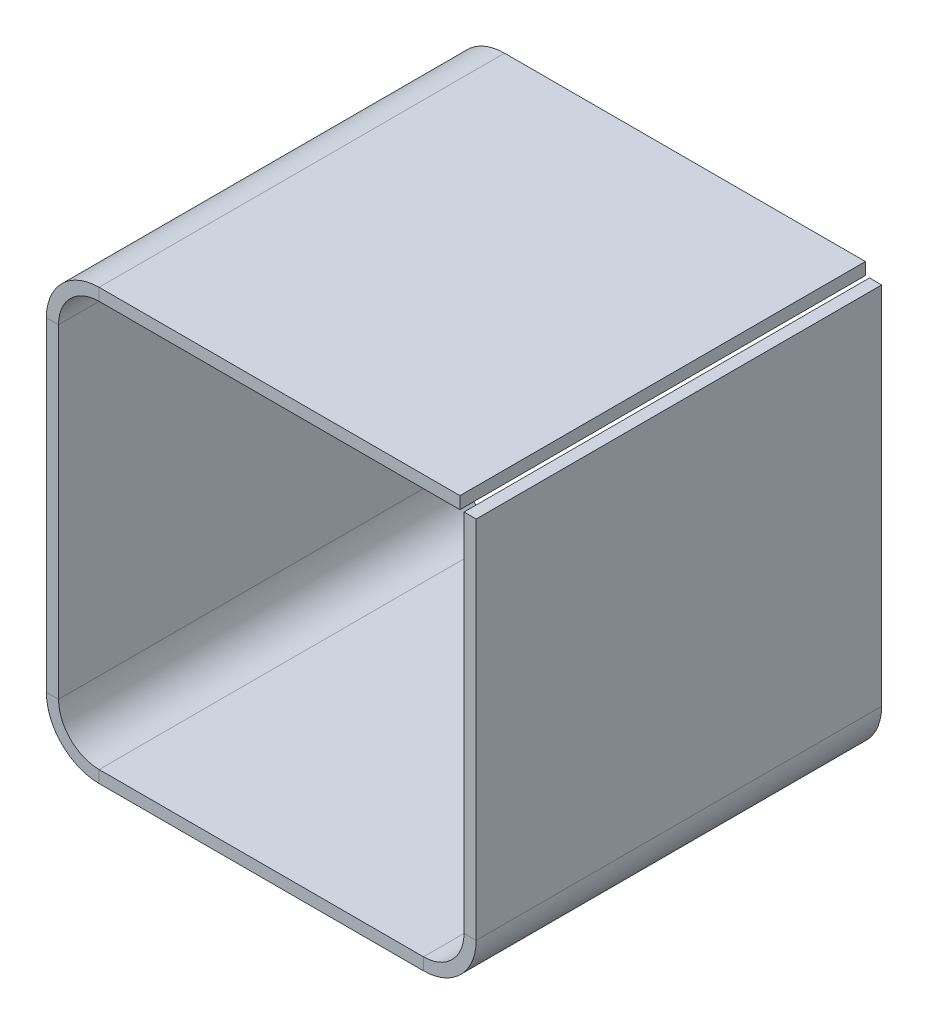
ISO-10303-21;
HEADER;
FILE_DESCRIPTION(('STEP AP214'),'2;1');
FILE_NAME('part.step','',(''),(''),'','','');
FILE_SCHEMA(('AUTOMOTIVE_DESIGN { 1 0 10303 214 1 1 1 1 }'));
ENDSEC;
DATA;
#1=APPLICATION_CONTEXT('core data for automotive mechanical design processes');
#2=APPLICATION_PROTOCOL_DEFINITION('international standard','automotive_design',2000,#1);
#3=PRODUCT_CONTEXT('',#1,'mechanical');
#4=PRODUCT('Part','Part','',(#3));
#5=PRODUCT_RELATED_PRODUCT_CATEGORY('part','',(#4));
#6=PRODUCT_DEFINITION_FORMATION('','',#4);
#7=PRODUCT_DEFINITION_CONTEXT('part definition',#1,'design');
#8=PRODUCT_DEFINITION('design','',#6,#7);
#9=PRODUCT_DEFINITION_SHAPE('','',#8);
#10=(LENGTH_UNIT() NAMED_UNIT(*) SI_UNIT(.MILLI.,.METRE.));
#11=(NAMED_UNIT(*) PLANE_ANGLE_UNIT() SI_UNIT($,.RADIAN.));
#12=(NAMED_UNIT(*) SI_UNIT($,.STERADIAN.) SOLID_ANGLE_UNIT());
#13=UNCERTAINTY_MEASURE_WITH_UNIT(LENGTH_MEASURE(1.E-05),#10,'distance_accuracy_value','');
#14=(GEOMETRIC_REPRESENTATION_CONTEXT(3) GLOBAL_UNCERTAINTY_ASSIGNED_CONTEXT((#13)) GLOBAL_UNIT_ASSIGNED_CONTEXT((#10,
#11,#12)) REPRESENTATION_CONTEXT('',''));
#15=CARTESIAN_POINT('',(0.,0.,0.));
#16=DIRECTION('',(0.,0.,1.));
#17=DIRECTION('',(1.,0.,0.));
#18=AXIS2_PLACEMENT_3D('',#15,#16,#17);
#19=CARTESIAN_POINT('',(55.3093945286018,10.,100.));
#20=DIRECTION('',(0.,0.,1.));
#21=DIRECTION('',(1.,0.,0.));
#22=AXIS2_PLACEMENT_3D('',#19,#20,#21);
#23=PLANE('',#22);
#24=DIRECTION('',(1.,0.,0.));
#25=VECTOR('',#24,1.);
#26=CARTESIAN_POINT('',(55.3093945286018,10.,100.));
#27=LINE('',#26,#25);
#28=CARTESIAN_POINT('',(55.3093945286018,10.,100.));
#29=VERTEX_POINT('',#28);
#30=CARTESIAN_POINT('',(58.3093945286018,10.,100.));
#31=VERTEX_POINT('',#30);
#32=EDGE_CURVE('E11',#29,#31,#27,.T.);
#33=ORIENTED_EDGE('',*,*,#32,.F.);
#34=CARTESIAN_POINT('',(45.3093945286018,10.,100.));
#35=DIRECTION('',(0.,0.,1.));
#36=DIRECTION('',(1.,0.,0.));
#37=AXIS2_PLACEMENT_3D('',#34,#35,#36);
#38=CIRCLE('',#37,10.);
#39=CARTESIAN_POINT('',(45.3093945286018,0.,100.));
#40=VERTEX_POINT('',#39);
#41=EDGE_CURVE('E299',#40,#29,#38,.T.);
#42=ORIENTED_EDGE('',*,*,#41,.F.);
#43=DIRECTION('',(0.,1.,0.));
#44=VECTOR('',#43,1.);
#45=CARTESIAN_POINT('',(45.3093945286018,-3.,100.));
#46=LINE('',#45,#44);
#47=CARTESIAN_POINT('',(45.3093945286018,-3.,100.));
#48=VERTEX_POINT('',#47);
#49=EDGE_CURVE('E46',#48,#40,#46,.T.);
#50=ORIENTED_EDGE('',*,*,#49,.F.);
#51=CARTESIAN_POINT('',(45.3093945286018,10.,100.));
#52=DIRECTION('',(0.,0.,1.));
#53=DIRECTION('',(1.,0.,0.));
#54=AXIS2_PLACEMENT_3D('',#51,#52,#53);
#55=CIRCLE('',#54,13.);
#56=EDGE_CURVE('E194',#48,#31,#55,.T.);
#57=ORIENTED_EDGE('',*,*,#56,.T.);
#58=EDGE_LOOP('',(#33,#42,#50,#57));
#59=FACE_BOUND('',#58,.T.);
#60=ADVANCED_FACE('F38',(#59),#23,.T.);
#61=CARTESIAN_POINT('',(45.3093945286018,-3.,100.));
#62=DIRECTION('',(0.,0.,1.));
#63=DIRECTION('',(1.,0.,0.));
#64=AXIS2_PLACEMENT_3D('',#61,#62,#63);
#65=PLANE('',#64);
#66=DIRECTION('',(0.,1.,0.));
#67=VECTOR('',#66,1.);
#68=CARTESIAN_POINT('',(55.3093945286019,0.,100.));
#69=LINE('',#68,#67);
#70=CARTESIAN_POINT('',(55.3093945286015,100.,100.));
#71=VERTEX_POINT('',#70);
#72=EDGE_CURVE('E303',#29,#71,#69,.T.);
#73=ORIENTED_EDGE('',*,*,#72,.F.);
#74=ORIENTED_EDGE('',*,*,#32,.T.);
#75=DIRECTION('',(0.,1.,0.));
#76=VECTOR('',#75,1.);
#77=CARTESIAN_POINT('',(58.3093945286019,0.,100.));
#78=LINE('',#77,#76);
#79=CARTESIAN_POINT('',(58.3093945286015,100.,100.));
#80=VERTEX_POINT('',#79);
#81=EDGE_CURVE('E118',#31,#80,#78,.T.);
#82=ORIENTED_EDGE('',*,*,#81,.T.);
#83=DIRECTION('',(1.,0.,0.));
#84=VECTOR('',#83,1.);
#85=CARTESIAN_POINT('',(55.3093945286015,100.,100.));
#86=LINE('',#85,#84);
#87=EDGE_CURVE('E694',#71,#80,#86,.T.);
#88=ORIENTED_EDGE('',*,*,#87,.F.);
#89=EDGE_LOOP('',(#73,#74,#82,#88));
#90=FACE_BOUND('',#89,.T.);
#91=ADVANCED_FACE('F392',(#90),#65,.T.);
#92=CARTESIAN_POINT('',(45.3093945286018,0.,0.));
#93=DIRECTION('',(0.,0.,-1.));
#94=DIRECTION('',(-1.,0.,0.));
#95=AXIS2_PLACEMENT_3D('',#92,#93,#94);
#96=PLANE('',#95);
#97=DIRECTION('',(0.,-1.,0.));
#98=VECTOR('',#97,1.);
#99=CARTESIAN_POINT('',(45.3093945286018,0.,0.));
#100=LINE('',#99,#98);
#101=CARTESIAN_POINT('',(45.3093945286018,0.,0.));
#102=VERTEX_POINT('',#101);
#103=CARTESIAN_POINT('',(45.3093945286018,-3.,0.));
#104=VERTEX_POINT('',#103);
#105=EDGE_CURVE('E105',#102,#104,#100,.T.);
#106=ORIENTED_EDGE('',*,*,#105,.F.);
#107=CARTESIAN_POINT('',(45.3093945286018,10.,0.));
#108=DIRECTION('',(0.,0.,1.));
#109=DIRECTION('',(1.,0.,0.));
#110=AXIS2_PLACEMENT_3D('',#107,#108,#109);
#111=CIRCLE('',#110,10.);
#112=CARTESIAN_POINT('',(55.3093945286018,10.,0.));
#113=VERTEX_POINT('',#112);
#114=EDGE_CURVE('E209',#102,#113,#111,.T.);
#115=ORIENTED_EDGE('',*,*,#114,.T.);
#116=DIRECTION('',(-1.,0.,0.));
#117=VECTOR('',#116,1.);
#118=CARTESIAN_POINT('',(58.3093945286018,10.,0.));
#119=LINE('',#118,#117);
#120=CARTESIAN_POINT('',(58.3093945286018,10.,0.));
#121=VERTEX_POINT('',#120);
#122=EDGE_CURVE('E112',#121,#113,#119,.T.);
#123=ORIENTED_EDGE('',*,*,#122,.F.);
#124=CARTESIAN_POINT('',(45.3093945286018,10.,0.));
#125=DIRECTION('',(0.,0.,1.));
#126=DIRECTION('',(1.,0.,0.));
#127=AXIS2_PLACEMENT_3D('',#124,#125,#126);
#128=CIRCLE('',#127,13.);
#129=EDGE_CURVE('E240',#104,#121,#128,.T.);
#130=ORIENTED_EDGE('',*,*,#129,.F.);
#131=EDGE_LOOP('',(#106,#115,#123,#130));
#132=FACE_BOUND('',#131,.T.);
#133=ADVANCED_FACE('F396',(#132),#96,.T.);
#134=CARTESIAN_POINT('',(58.3093945286018,10.,0.));
#135=DIRECTION('',(0.,0.,-1.));
#136=DIRECTION('',(-1.,0.,0.));
#137=AXIS2_PLACEMENT_3D('',#134,#135,#136);
#138=PLANE('',#137);
#139=DIRECTION('',(1.,0.,0.));
#140=VECTOR('',#139,1.);
#141=CARTESIAN_POINT('',(-44.6906054713981,0.,0.));
#142=LINE('',#141,#140);
#143=CARTESIAN_POINT('',(-34.6906054713981,0.,0.));
#144=VERTEX_POINT('',#143);
#145=EDGE_CURVE('E211',#144,#102,#142,.T.);
#146=ORIENTED_EDGE('',*,*,#145,.T.);
#147=ORIENTED_EDGE('',*,*,#105,.T.);
#148=DIRECTION('',(1.,0.,0.));
#149=VECTOR('',#148,1.);
#150=CARTESIAN_POINT('',(-44.6906054713981,-3.,0.));
#151=LINE('',#150,#149);
#152=CARTESIAN_POINT('',(-34.6906054713981,-3.,0.));
#153=VERTEX_POINT('',#152);
#154=EDGE_CURVE('E238',#153,#104,#151,.T.);
#155=ORIENTED_EDGE('',*,*,#154,.F.);
#156=DIRECTION('',(0.,1.,0.));
#157=VECTOR('',#156,1.);
#158=CARTESIAN_POINT('',(-34.6906054713981,-3.,0.));
#159=LINE('',#158,#157);
#160=EDGE_CURVE('E286',#153,#144,#159,.T.);
#161=ORIENTED_EDGE('',*,*,#160,.T.);
#162=EDGE_LOOP('',(#146,#147,#155,#161));
#163=FACE_BOUND('',#162,.T.);
#164=ADVANCED_FACE('F340',(#163),#138,.T.);
#165=CARTESIAN_POINT('',(-34.6906054713981,0.,100.));
#166=DIRECTION('',(0.,0.,1.));
#167=DIRECTION('',(1.,0.,0.));
#168=AXIS2_PLACEMENT_3D('',#165,#166,#167);
#169=PLANE('',#168);
#170=DIRECTION('',(0.,-1.,0.));
#171=VECTOR('',#170,1.);
#172=CARTESIAN_POINT('',(-34.6906054713981,0.,100.));
#173=LINE('',#172,#171);
#174=CARTESIAN_POINT('',(-34.6906054713981,0.,100.));
#175=VERTEX_POINT('',#174);
#176=CARTESIAN_POINT('',(-34.6906054713981,-3.,100.));
#177=VERTEX_POINT('',#176);
#178=EDGE_CURVE('E158',#175,#177,#173,.T.);
#179=ORIENTED_EDGE('',*,*,#178,.F.);
#180=CARTESIAN_POINT('',(-34.6906054713981,10.,100.));
#181=DIRECTION('',(0.,0.,1.));
#182=DIRECTION('',(1.,0.,0.));
#183=AXIS2_PLACEMENT_3D('',#180,#181,#182);
#184=CIRCLE('',#183,10.);
#185=CARTESIAN_POINT('',(-44.6906054713981,10.,100.));
#186=VERTEX_POINT('',#185);
#187=EDGE_CURVE('E306',#186,#175,#184,.T.);
#188=ORIENTED_EDGE('',*,*,#187,.F.);
#189=DIRECTION('',(1.,0.,0.));
#190=VECTOR('',#189,1.);
#191=CARTESIAN_POINT('',(-47.6906054713981,10.,100.));
#192=LINE('',#191,#190);
#193=CARTESIAN_POINT('',(-47.6906054713981,10.,100.));
#194=VERTEX_POINT('',#193);
#195=EDGE_CURVE('E170',#194,#186,#192,.T.);
#196=ORIENTED_EDGE('',*,*,#195,.F.);
#197=CARTESIAN_POINT('',(-34.6906054713981,10.,100.));
#198=DIRECTION('',(0.,0.,1.));
#199=DIRECTION('',(1.,0.,0.));
#200=AXIS2_PLACEMENT_3D('',#197,#198,#199);
#201=CIRCLE('',#200,13.);
#202=EDGE_CURVE('E173',#194,#177,#201,.T.);
#203=ORIENTED_EDGE('',*,*,#202,.T.);
#204=EDGE_LOOP('',(#179,#188,#196,#203));
#205=FACE_BOUND('',#204,.T.);
#206=ADVANCED_FACE('F175',(#205),#169,.T.);
#207=CARTESIAN_POINT('',(-47.6906054713981,10.,100.));
#208=DIRECTION('',(0.,0.,1.));
#209=DIRECTION('',(1.,0.,0.));
#210=AXIS2_PLACEMENT_3D('',#207,#208,#209);
#211=PLANE('',#210);
#212=DIRECTION('',(1.,0.,0.));
#213=VECTOR('',#212,1.);
#214=CARTESIAN_POINT('',(-44.6906054713981,0.,100.));
#215=LINE('',#214,#213);
#216=EDGE_CURVE('E165',#175,#40,#215,.T.);
#217=ORIENTED_EDGE('',*,*,#216,.F.);
#218=ORIENTED_EDGE('',*,*,#178,.T.);
#219=DIRECTION('',(1.,0.,0.));
#220=VECTOR('',#219,1.);
#221=CARTESIAN_POINT('',(-44.6906054713981,-3.,100.));
#222=LINE('',#221,#220);
#223=EDGE_CURVE('E162',#177,#48,#222,.T.);
#224=ORIENTED_EDGE('',*,*,#223,.T.);
#225=ORIENTED_EDGE('',*,*,#49,.T.);
#226=EDGE_LOOP('',(#217,#218,#224,#225));
#227=FACE_BOUND('',#226,.T.);
#228=ADVANCED_FACE('F160',(#227),#211,.T.);
#229=CARTESIAN_POINT('',(-44.6906054713981,10.,0.));
#230=DIRECTION('',(0.,0.,-1.));
#231=DIRECTION('',(-1.,0.,0.));
#232=AXIS2_PLACEMENT_3D('',#229,#230,#231);
#233=PLANE('',#232);
#234=DIRECTION('',(-1.,0.,0.));
#235=VECTOR('',#234,1.);
#236=CARTESIAN_POINT('',(-44.6906054713981,10.,0.));
#237=LINE('',#236,#235);
#238=CARTESIAN_POINT('',(-44.6906054713981,10.,0.));
#239=VERTEX_POINT('',#238);
#240=CARTESIAN_POINT('',(-47.6906054713981,10.,0.));
#241=VERTEX_POINT('',#240);
#242=EDGE_CURVE('E288',#239,#241,#237,.T.);
#243=ORIENTED_EDGE('',*,*,#242,.F.);
#244=CARTESIAN_POINT('',(-34.6906054713981,10.,0.));
#245=DIRECTION('',(0.,0.,1.));
#246=DIRECTION('',(1.,0.,0.));
#247=AXIS2_PLACEMENT_3D('',#244,#245,#246);
#248=CIRCLE('',#247,10.);
#249=EDGE_CURVE('E213',#239,#144,#248,.T.);
#250=ORIENTED_EDGE('',*,*,#249,.T.);
#251=ORIENTED_EDGE('',*,*,#160,.F.);
#252=CARTESIAN_POINT('',(-34.6906054713981,10.,0.));
#253=DIRECTION('',(0.,0.,1.));
#254=DIRECTION('',(1.,0.,0.));
#255=AXIS2_PLACEMENT_3D('',#252,#253,#254);
#256=CIRCLE('',#255,13.);
#257=EDGE_CURVE('E186',#241,#153,#256,.T.);
#258=ORIENTED_EDGE('',*,*,#257,.F.);
#259=EDGE_LOOP('',(#243,#250,#251,#258));
#260=FACE_BOUND('',#259,.T.);
#261=ADVANCED_FACE('F338',(#260),#233,.T.);
#262=CARTESIAN_POINT('',(-34.6906054713981,-3.,0.));
#263=DIRECTION('',(0.,0.,-1.));
#264=DIRECTION('',(-1.,0.,0.));
#265=AXIS2_PLACEMENT_3D('',#262,#263,#264);
#266=PLANE('',#265);
#267=DIRECTION('',(0.,-1.,0.));
#268=VECTOR('',#267,1.);
#269=CARTESIAN_POINT('',(-44.6906054713978,100.,0.));
#270=LINE('',#269,#268);
#271=CARTESIAN_POINT('',(-44.6906054713978,90.,0.));
#272=VERTEX_POINT('',#271);
#273=EDGE_CURVE('E216',#272,#239,#270,.T.);
#274=ORIENTED_EDGE('',*,*,#273,.T.);
#275=ORIENTED_EDGE('',*,*,#242,.T.);
#276=DIRECTION('',(0.,-1.,0.));
#277=VECTOR('',#276,1.);
#278=CARTESIAN_POINT('',(-47.6906054713978,100.,0.));
#279=LINE('',#278,#277);
#280=CARTESIAN_POINT('',(-47.6906054713978,90.,0.));
#281=VERTEX_POINT('',#280);
#282=EDGE_CURVE('E234',#281,#241,#279,.T.);
#283=ORIENTED_EDGE('',*,*,#282,.F.);
#284=DIRECTION('',(1.,0.,0.));
#285=VECTOR('',#284,1.);
#286=CARTESIAN_POINT('',(-47.6906054713978,90.,0.));
#287=LINE('',#286,#285);
#288=EDGE_CURVE('E278',#281,#272,#287,.T.);
#289=ORIENTED_EDGE('',*,*,#288,.T.);
#290=EDGE_LOOP('',(#274,#275,#283,#289));
#291=FACE_BOUND('',#290,.T.);
#292=ADVANCED_FACE('F375',(#291),#266,.T.);
#293=CARTESIAN_POINT('',(-44.6906054713978,90.,100.));
#294=DIRECTION('',(0.,0.,1.));
#295=DIRECTION('',(1.,0.,0.));
#296=AXIS2_PLACEMENT_3D('',#293,#294,#295);
#297=PLANE('',#296);
#298=DIRECTION('',(-1.,0.,0.));
#299=VECTOR('',#298,1.);
#300=CARTESIAN_POINT('',(-44.6906054713978,90.,100.));
#301=LINE('',#300,#299);
#302=CARTESIAN_POINT('',(-44.6906054713978,90.,100.));
#303=VERTEX_POINT('',#302);
#304=CARTESIAN_POINT('',(-47.6906054713978,90.,100.));
#305=VERTEX_POINT('',#304);
#306=EDGE_CURVE('E284',#303,#305,#301,.T.);
#307=ORIENTED_EDGE('',*,*,#306,.F.);
#308=CARTESIAN_POINT('',(-34.6906054713978,90.,100.));
#309=DIRECTION('',(0.,0.,1.));
#310=DIRECTION('',(1.,0.,0.));
#311=AXIS2_PLACEMENT_3D('',#308,#309,#310);
#312=CIRCLE('',#311,10.);
#313=CARTESIAN_POINT('',(-34.6906054713978,100.,100.));
#314=VERTEX_POINT('',#313);
#315=EDGE_CURVE('E314',#314,#303,#312,.T.);
#316=ORIENTED_EDGE('',*,*,#315,.F.);
#317=DIRECTION('',(0.,-1.,0.));
#318=VECTOR('',#317,1.);
#319=CARTESIAN_POINT('',(-34.6906054713978,103.,100.));
#320=LINE('',#319,#318);
#321=CARTESIAN_POINT('',(-34.6906054713978,103.,100.));
#322=VERTEX_POINT('',#321);
#323=EDGE_CURVE('E282',#322,#314,#320,.T.);
#324=ORIENTED_EDGE('',*,*,#323,.F.);
#325=CARTESIAN_POINT('',(-34.6906054713978,90.,100.));
#326=DIRECTION('',(0.,0.,1.));
#327=DIRECTION('',(1.,0.,0.));
#328=AXIS2_PLACEMENT_3D('',#325,#326,#327);
#329=CIRCLE('',#328,13.);
#330=EDGE_CURVE('E326',#322,#305,#329,.T.);
#331=ORIENTED_EDGE('',*,*,#330,.T.);
#332=EDGE_LOOP('',(#307,#316,#324,#331));
#333=FACE_BOUND('',#332,.T.);
#334=ADVANCED_FACE('F353',(#333),#297,.T.);
#335=CARTESIAN_POINT('',(-34.6906054713978,103.,100.));
#336=DIRECTION('',(0.,0.,1.));
#337=DIRECTION('',(1.,0.,0.));
#338=AXIS2_PLACEMENT_3D('',#335,#336,#337);
#339=PLANE('',#338);
#340=DIRECTION('',(0.,-1.,0.));
#341=VECTOR('',#340,1.);
#342=CARTESIAN_POINT('',(-44.6906054713978,100.,100.));
#343=LINE('',#342,#341);
#344=EDGE_CURVE('E308',#303,#186,#343,.T.);
#345=ORIENTED_EDGE('',*,*,#344,.F.);
#346=ORIENTED_EDGE('',*,*,#306,.T.);
#347=DIRECTION('',(0.,-1.,0.));
#348=VECTOR('',#347,1.);
#349=CARTESIAN_POINT('',(-47.6906054713978,100.,100.));
#350=LINE('',#349,#348);
#351=EDGE_CURVE('E179',#305,#194,#350,.T.);
#352=ORIENTED_EDGE('',*,*,#351,.T.);
#353=ORIENTED_EDGE('',*,*,#195,.T.);
#354=EDGE_LOOP('',(#345,#346,#352,#353));
#355=FACE_BOUND('',#354,.T.);
#356=ADVANCED_FACE('F332',(#355),#339,.T.);
#357=CARTESIAN_POINT('',(-34.6906054713978,100.,0.));
#358=DIRECTION('',(0.,0.,-1.));
#359=DIRECTION('',(-1.,0.,0.));
#360=AXIS2_PLACEMENT_3D('',#357,#358,#359);
#361=PLANE('',#360);
#362=DIRECTION('',(0.,1.,0.));
#363=VECTOR('',#362,1.);
#364=CARTESIAN_POINT('',(-34.6906054713978,100.,0.));
#365=LINE('',#364,#363);
#366=CARTESIAN_POINT('',(-34.6906054713978,100.,0.));
#367=VERTEX_POINT('',#366);
#368=CARTESIAN_POINT('',(-34.6906054713978,103.,0.));
#369=VERTEX_POINT('',#368);
#370=EDGE_CURVE('E280',#367,#369,#365,.T.);
#371=ORIENTED_EDGE('',*,*,#370,.F.);
#372=CARTESIAN_POINT('',(-34.6906054713978,90.,0.));
#373=DIRECTION('',(0.,0.,1.));
#374=DIRECTION('',(1.,0.,0.));
#375=AXIS2_PLACEMENT_3D('',#372,#373,#374);
#376=CIRCLE('',#375,10.);
#377=EDGE_CURVE('E219',#367,#272,#376,.T.);
#378=ORIENTED_EDGE('',*,*,#377,.T.);
#379=ORIENTED_EDGE('',*,*,#288,.F.);
#380=CARTESIAN_POINT('',(-34.6906054713978,90.,0.));
#381=DIRECTION('',(0.,0.,1.));
#382=DIRECTION('',(1.,0.,0.));
#383=AXIS2_PLACEMENT_3D('',#380,#381,#382);
#384=CIRCLE('',#383,13.);
#385=EDGE_CURVE('E231',#369,#281,#384,.T.);
#386=ORIENTED_EDGE('',*,*,#385,.F.);
#387=EDGE_LOOP('',(#371,#378,#379,#386));
#388=FACE_BOUND('',#387,.T.);
#389=ADVANCED_FACE('F377',(#388),#361,.T.);
#390=CARTESIAN_POINT('',(-47.6906054713978,90.,0.));
#391=DIRECTION('',(0.,0.,-1.));
#392=DIRECTION('',(-1.,0.,0.));
#393=AXIS2_PLACEMENT_3D('',#390,#391,#392);
#394=PLANE('',#393);
#395=DIRECTION('',(-1.,0.,0.));
#396=VECTOR('',#395,1.);
#397=CARTESIAN_POINT('',(-44.6906054713978,100.,0.));
#398=LINE('',#397,#396);
#399=CARTESIAN_POINT('',(54.3093945286022,99.9999999999996,0.));
#400=VERTEX_POINT('',#399);
#401=EDGE_CURVE('E222',#400,#367,#398,.T.);
#402=ORIENTED_EDGE('',*,*,#401,.T.);
#403=ORIENTED_EDGE('',*,*,#370,.T.);
#404=DIRECTION('',(-1.,0.,0.));
#405=VECTOR('',#404,1.);
#406=CARTESIAN_POINT('',(-44.6906054713978,103.,0.));
#407=LINE('',#406,#405);
#408=CARTESIAN_POINT('',(54.3093945286022,103.,0.));
#409=VERTEX_POINT('',#408);
#410=EDGE_CURVE('E228',#409,#369,#407,.T.);
#411=ORIENTED_EDGE('',*,*,#410,.F.);
#412=DIRECTION('',(0.,-1.,0.));
#413=VECTOR('',#412,1.);
#414=CARTESIAN_POINT('',(54.3093945286022,103.,0.));
#415=LINE('',#414,#413);
#416=EDGE_CURVE('E225',#409,#400,#415,.T.);
#417=ORIENTED_EDGE('',*,*,#416,.T.);
#418=EDGE_LOOP('',(#402,#403,#411,#417));
#419=FACE_BOUND('',#418,.T.);
#420=ADVANCED_FACE('F379',(#419),#394,.T.);
#421=CARTESIAN_POINT('',(58.3093945286019,0.,100.));
#422=DIRECTION('',(-1.,0.,0.));
#423=DIRECTION('',(0.,-1.,0.));
#424=AXIS2_PLACEMENT_3D('',#421,#422,#423);
#425=PLANE('',#424);
#426=DIRECTION('',(0.,1.,0.));
#427=VECTOR('',#426,1.);
#428=CARTESIAN_POINT('',(58.3093945286019,0.,0.));
#429=LINE('',#428,#427);
#430=CARTESIAN_POINT('',(58.3093945286015,100.,0.));
#431=VERTEX_POINT('',#430);
#432=EDGE_CURVE('E200',#121,#431,#429,.T.);
#433=ORIENTED_EDGE('',*,*,#432,.T.);
#434=DIRECTION('',(0.,0.,-1.));
#435=VECTOR('',#434,1.);
#436=CARTESIAN_POINT('',(58.3093945286015,100.,100.));
#437=LINE('',#436,#435);
#438=EDGE_CURVE('E276',#80,#431,#437,.T.);
#439=ORIENTED_EDGE('',*,*,#438,.F.);
#440=ORIENTED_EDGE('',*,*,#81,.F.);
#441=DIRECTION('',(0.,0.,-1.));
#442=VECTOR('',#441,1.);
#443=CARTESIAN_POINT('',(58.3093945286018,10.,100.));
#444=LINE('',#443,#442);
#445=EDGE_CURVE('E196',#31,#121,#444,.T.);
#446=ORIENTED_EDGE('',*,*,#445,.T.);
#447=EDGE_LOOP('',(#433,#439,#440,#446));
#448=FACE_BOUND('',#447,.T.);
#449=ADVANCED_FACE('F381',(#448),#425,.F.);
#450=CARTESIAN_POINT('',(55.3093945286015,100.,100.));
#451=DIRECTION('',(0.,1.,0.));
#452=DIRECTION('',(-1.,0.,0.));
#453=AXIS2_PLACEMENT_3D('',#450,#451,#452);
#454=PLANE('',#453);
#455=DIRECTION('',(1.,0.,0.));
#456=VECTOR('',#455,1.);
#457=CARTESIAN_POINT('',(55.3093945286015,100.,0.));
#458=LINE('',#457,#456);
#459=CARTESIAN_POINT('',(55.3093945286015,100.,0.));
#460=VERTEX_POINT('',#459);
#461=EDGE_CURVE('E203',#460,#431,#458,.T.);
#462=ORIENTED_EDGE('',*,*,#461,.F.);
#463=DIRECTION('',(0.,0.,-1.));
#464=VECTOR('',#463,1.);
#465=CARTESIAN_POINT('',(55.3093945286015,100.,100.));
#466=LINE('',#465,#464);
#467=EDGE_CURVE('E274',#71,#460,#466,.T.);
#468=ORIENTED_EDGE('',*,*,#467,.F.);
#469=ORIENTED_EDGE('',*,*,#87,.T.);
#470=ORIENTED_EDGE('',*,*,#438,.T.);
#471=EDGE_LOOP('',(#462,#468,#469,#470));
#472=FACE_BOUND('',#471,.T.);
#473=ADVANCED_FACE('F387',(#472),#454,.T.);
#474=CARTESIAN_POINT('',(55.3093945286019,0.,100.));
#475=DIRECTION('',(-1.,0.,0.));
#476=DIRECTION('',(0.,-1.,0.));
#477=AXIS2_PLACEMENT_3D('',#474,#475,#476);
#478=PLANE('',#477);
#479=DIRECTION('',(0.,1.,0.));
#480=VECTOR('',#479,1.);
#481=CARTESIAN_POINT('',(55.3093945286019,0.,0.));
#482=LINE('',#481,#480);
#483=EDGE_CURVE('E206',#113,#460,#482,.T.);
#484=ORIENTED_EDGE('',*,*,#483,.F.);
#485=DIRECTION('',(0.,0.,-1.));
#486=VECTOR('',#485,1.);
#487=CARTESIAN_POINT('',(55.3093945286018,10.,100.));
#488=LINE('',#487,#486);
#489=EDGE_CURVE('E271',#29,#113,#488,.T.);
#490=ORIENTED_EDGE('',*,*,#489,.F.);
#491=ORIENTED_EDGE('',*,*,#72,.T.);
#492=ORIENTED_EDGE('',*,*,#467,.T.);
#493=EDGE_LOOP('',(#484,#490,#491,#492));
#494=FACE_BOUND('',#493,.T.);
#495=ADVANCED_FACE('F445',(#494),#478,.T.);
#496=CARTESIAN_POINT('',(45.3093945286018,10.,100.));
#497=DIRECTION('',(0.,0.,-1.));
#498=DIRECTION('',(-1.,0.,0.));
#499=AXIS2_PLACEMENT_3D('',#496,#497,#498);
#500=CYLINDRICAL_SURFACE('',#499,10.);
#501=ORIENTED_EDGE('',*,*,#114,.F.);
#502=DIRECTION('',(0.,0.,-1.));
#503=VECTOR('',#502,1.);
#504=CARTESIAN_POINT('',(45.3093945286018,0.,100.));
#505=LINE('',#504,#503);
#506=EDGE_CURVE('E268',#40,#102,#505,.T.);
#507=ORIENTED_EDGE('',*,*,#506,.F.);
#508=ORIENTED_EDGE('',*,*,#41,.T.);
#509=ORIENTED_EDGE('',*,*,#489,.T.);
#510=EDGE_LOOP('',(#501,#507,#508,#509));
#511=FACE_BOUND('',#510,.T.);
#512=ADVANCED_FACE('F298',(#511),#500,.F.);
#513=CARTESIAN_POINT('',(-44.6906054713981,0.,100.));
#514=DIRECTION('',(0.,1.,0.));
#515=DIRECTION('',(0.,0.,1.));
#516=AXIS2_PLACEMENT_3D('',#513,#514,#515);
#517=PLANE('',#516);
#518=ORIENTED_EDGE('',*,*,#145,.F.);
#519=DIRECTION('',(0.,0.,-1.));
#520=VECTOR('',#519,1.);
#521=CARTESIAN_POINT('',(-34.6906054713981,0.,100.));
#522=LINE('',#521,#520);
#523=EDGE_CURVE('E265',#175,#144,#522,.T.);
#524=ORIENTED_EDGE('',*,*,#523,.F.);
#525=ORIENTED_EDGE('',*,*,#216,.T.);
#526=ORIENTED_EDGE('',*,*,#506,.T.);
#527=EDGE_LOOP('',(#518,#524,#525,#526));
#528=FACE_BOUND('',#527,.T.);
#529=ADVANCED_FACE('F305',(#528),#517,.T.);
#530=CARTESIAN_POINT('',(-34.6906054713981,10.,100.));
#531=DIRECTION('',(0.,0.,-1.));
#532=DIRECTION('',(-1.,0.,0.));
#533=AXIS2_PLACEMENT_3D('',#530,#531,#532);
#534=CYLINDRICAL_SURFACE('',#533,10.);
#535=ORIENTED_EDGE('',*,*,#249,.F.);
#536=DIRECTION('',(0.,0.,-1.));
#537=VECTOR('',#536,1.);
#538=CARTESIAN_POINT('',(-44.6906054713981,10.,100.));
#539=LINE('',#538,#537);
#540=EDGE_CURVE('E262',#186,#239,#539,.T.);
#541=ORIENTED_EDGE('',*,*,#540,.F.);
#542=ORIENTED_EDGE('',*,*,#187,.T.);
#543=ORIENTED_EDGE('',*,*,#523,.T.);
#544=EDGE_LOOP('',(#535,#541,#542,#543));
#545=FACE_BOUND('',#544,.T.);
#546=ADVANCED_FACE('F342',(#545),#534,.F.);
#547=CARTESIAN_POINT('',(-44.6906054713978,100.,100.));
#548=DIRECTION('',(1.,0.,0.));
#549=DIRECTION('',(0.,1.,0.));
#550=AXIS2_PLACEMENT_3D('',#547,#548,#549);
#551=PLANE('',#550);
#552=ORIENTED_EDGE('',*,*,#273,.F.);
#553=DIRECTION('',(0.,0.,-1.));
#554=VECTOR('',#553,1.);
#555=CARTESIAN_POINT('',(-44.6906054713978,90.,100.));
#556=LINE('',#555,#554);
#557=EDGE_CURVE('E259',#303,#272,#556,.T.);
#558=ORIENTED_EDGE('',*,*,#557,.F.);
#559=ORIENTED_EDGE('',*,*,#344,.T.);
#560=ORIENTED_EDGE('',*,*,#540,.T.);
#561=EDGE_LOOP('',(#552,#558,#559,#560));
#562=FACE_BOUND('',#561,.T.);
#563=ADVANCED_FACE('F346',(#562),#551,.T.);
#564=CARTESIAN_POINT('',(-34.6906054713978,90.,100.));
#565=DIRECTION('',(0.,0.,-1.));
#566=DIRECTION('',(-1.,0.,0.));
#567=AXIS2_PLACEMENT_3D('',#564,#565,#566);
#568=CYLINDRICAL_SURFACE('',#567,10.);
#569=ORIENTED_EDGE('',*,*,#377,.F.);
#570=DIRECTION('',(0.,0.,-1.));
#571=VECTOR('',#570,1.);
#572=CARTESIAN_POINT('',(-34.6906054713978,100.,100.));
#573=LINE('',#572,#571);
#574=EDGE_CURVE('E256',#314,#367,#573,.T.);
#575=ORIENTED_EDGE('',*,*,#574,.F.);
#576=ORIENTED_EDGE('',*,*,#315,.T.);
#577=ORIENTED_EDGE('',*,*,#557,.T.);
#578=EDGE_LOOP('',(#569,#575,#576,#577));
#579=FACE_BOUND('',#578,.T.);
#580=ADVANCED_FACE('F351',(#579),#568,.F.);
#581=CARTESIAN_POINT('',(-44.6906054713978,100.,100.));
#582=DIRECTION('',(0.,-1.,0.));
#583=DIRECTION('',(1.,0.,0.));
#584=AXIS2_PLACEMENT_3D('',#581,#582,#583);
#585=PLANE('',#584);
#586=ORIENTED_EDGE('',*,*,#401,.F.);
#587=DIRECTION('',(0.,0.,-1.));
#588=VECTOR('',#587,1.);
#589=CARTESIAN_POINT('',(54.3093945286022,99.9999999999996,100.));
#590=LINE('',#589,#588);
#591=CARTESIAN_POINT('',(54.3093945286022,99.9999999999996,100.));
#592=VERTEX_POINT('',#591);
#593=EDGE_CURVE('E254',#592,#400,#590,.T.);
#594=ORIENTED_EDGE('',*,*,#593,.F.);
#595=DIRECTION('',(-1.,0.,0.));
#596=VECTOR('',#595,1.);
#597=CARTESIAN_POINT('',(-44.6906054713978,100.,100.));
#598=LINE('',#597,#596);
#599=EDGE_CURVE('E317',#592,#314,#598,.T.);
#600=ORIENTED_EDGE('',*,*,#599,.T.);
#601=ORIENTED_EDGE('',*,*,#574,.T.);
#602=EDGE_LOOP('',(#586,#594,#600,#601));
#603=FACE_BOUND('',#602,.T.);
#604=ADVANCED_FACE('F357',(#603),#585,.T.);
#605=CARTESIAN_POINT('',(54.3093945286022,103.,100.));
#606=DIRECTION('',(1.,0.,0.));
#607=DIRECTION('',(0.,1.,0.));
#608=AXIS2_PLACEMENT_3D('',#605,#606,#607);
#609=PLANE('',#608);
#610=ORIENTED_EDGE('',*,*,#416,.F.);
#611=DIRECTION('',(0.,0.,-1.));
#612=VECTOR('',#611,1.);
#613=CARTESIAN_POINT('',(54.3093945286022,103.,100.));
#614=LINE('',#613,#612);
#615=CARTESIAN_POINT('',(54.3093945286022,103.,100.));
#616=VERTEX_POINT('',#615);
#617=EDGE_CURVE('E252',#616,#409,#614,.T.);
#618=ORIENTED_EDGE('',*,*,#617,.F.);
#619=DIRECTION('',(0.,-1.,0.));
#620=VECTOR('',#619,1.);
#621=CARTESIAN_POINT('',(54.3093945286022,103.,100.));
#622=LINE('',#621,#620);
#623=EDGE_CURVE('E320',#616,#592,#622,.T.);
#624=ORIENTED_EDGE('',*,*,#623,.T.);
#625=ORIENTED_EDGE('',*,*,#593,.T.);
#626=EDGE_LOOP('',(#610,#618,#624,#625));
#627=FACE_BOUND('',#626,.T.);
#628=ADVANCED_FACE('F363',(#627),#609,.T.);
#629=CARTESIAN_POINT('',(-44.6906054713978,103.,100.));
#630=DIRECTION('',(0.,-1.,0.));
#631=DIRECTION('',(1.,0.,0.));
#632=AXIS2_PLACEMENT_3D('',#629,#630,#631);
#633=PLANE('',#632);
#634=ORIENTED_EDGE('',*,*,#410,.T.);
#635=DIRECTION('',(0.,0.,-1.));
#636=VECTOR('',#635,1.);
#637=CARTESIAN_POINT('',(-34.6906054713978,103.,100.));
#638=LINE('',#637,#636);
#639=EDGE_CURVE('E249',#322,#369,#638,.T.);
#640=ORIENTED_EDGE('',*,*,#639,.F.);
#641=DIRECTION('',(-1.,0.,0.));
#642=VECTOR('',#641,1.);
#643=CARTESIAN_POINT('',(-44.6906054713978,103.,100.));
#644=LINE('',#643,#642);
#645=EDGE_CURVE('E323',#616,#322,#644,.T.);
#646=ORIENTED_EDGE('',*,*,#645,.F.);
#647=ORIENTED_EDGE('',*,*,#617,.T.);
#648=EDGE_LOOP('',(#634,#640,#646,#647));
#649=FACE_BOUND('',#648,.T.);
#650=ADVANCED_FACE('F368',(#649),#633,.F.);
#651=CARTESIAN_POINT('',(-34.6906054713978,90.,100.));
#652=DIRECTION('',(0.,0.,-1.));
#653=DIRECTION('',(-1.,0.,0.));
#654=AXIS2_PLACEMENT_3D('',#651,#652,#653);
#655=CYLINDRICAL_SURFACE('',#654,13.);
#656=ORIENTED_EDGE('',*,*,#385,.T.);
#657=DIRECTION('',(0.,0.,-1.));
#658=VECTOR('',#657,1.);
#659=CARTESIAN_POINT('',(-47.6906054713978,90.,100.));
#660=LINE('',#659,#658);
#661=EDGE_CURVE('E246',#305,#281,#660,.T.);
#662=ORIENTED_EDGE('',*,*,#661,.F.);
#663=ORIENTED_EDGE('',*,*,#330,.F.);
#664=ORIENTED_EDGE('',*,*,#639,.T.);
#665=EDGE_LOOP('',(#656,#662,#663,#664));
#666=FACE_BOUND('',#665,.T.);
#667=ADVANCED_FACE('F373',(#666),#655,.T.);
#668=CARTESIAN_POINT('',(-47.6906054713978,100.,100.));
#669=DIRECTION('',(1.,0.,0.));
#670=DIRECTION('',(0.,1.,0.));
#671=AXIS2_PLACEMENT_3D('',#668,#669,#670);
#672=PLANE('',#671);
#673=ORIENTED_EDGE('',*,*,#282,.T.);
#674=DIRECTION('',(0.,0.,-1.));
#675=VECTOR('',#674,1.);
#676=CARTESIAN_POINT('',(-47.6906054713981,10.,100.));
#677=LINE('',#676,#675);
#678=EDGE_CURVE('E188',#194,#241,#677,.T.);
#679=ORIENTED_EDGE('',*,*,#678,.F.);
#680=ORIENTED_EDGE('',*,*,#351,.F.);
#681=ORIENTED_EDGE('',*,*,#661,.T.);
#682=EDGE_LOOP('',(#673,#679,#680,#681));
#683=FACE_BOUND('',#682,.T.);
#684=ADVANCED_FACE('F335',(#683),#672,.F.);
#685=CARTESIAN_POINT('',(-34.6906054713981,10.,100.));
#686=DIRECTION('',(0.,0.,-1.));
#687=DIRECTION('',(-1.,0.,0.));
#688=AXIS2_PLACEMENT_3D('',#685,#686,#687);
#689=CYLINDRICAL_SURFACE('',#688,13.);
#690=ORIENTED_EDGE('',*,*,#257,.T.);
#691=DIRECTION('',(0.,0.,-1.));
#692=VECTOR('',#691,1.);
#693=CARTESIAN_POINT('',(-34.6906054713981,-3.,100.));
#694=LINE('',#693,#692);
#695=EDGE_CURVE('E183',#177,#153,#694,.T.);
#696=ORIENTED_EDGE('',*,*,#695,.F.);
#697=ORIENTED_EDGE('',*,*,#202,.F.);
#698=ORIENTED_EDGE('',*,*,#678,.T.);
#699=EDGE_LOOP('',(#690,#696,#697,#698));
#700=FACE_BOUND('',#699,.T.);
#701=ADVANCED_FACE('F184',(#700),#689,.T.);
#702=CARTESIAN_POINT('',(-44.6906054713981,-3.,100.));
#703=DIRECTION('',(0.,1.,0.));
#704=DIRECTION('',(0.,0.,1.));
#705=AXIS2_PLACEMENT_3D('',#702,#703,#704);
#706=PLANE('',#705);
#707=ORIENTED_EDGE('',*,*,#154,.T.);
#708=DIRECTION('',(0.,0.,-1.));
#709=VECTOR('',#708,1.);
#710=CARTESIAN_POINT('',(45.3093945286018,-3.,100.));
#711=LINE('',#710,#709);
#712=EDGE_CURVE('E189',#48,#104,#711,.T.);
#713=ORIENTED_EDGE('',*,*,#712,.F.);
#714=ORIENTED_EDGE('',*,*,#223,.F.);
#715=ORIENTED_EDGE('',*,*,#695,.T.);
#716=EDGE_LOOP('',(#707,#713,#714,#715));
#717=FACE_BOUND('',#716,.T.);
#718=ADVANCED_FACE('F191',(#717),#706,.F.);
#719=CARTESIAN_POINT('',(45.3093945286018,10.,100.));
#720=DIRECTION('',(0.,0.,-1.));
#721=DIRECTION('',(-1.,0.,0.));
#722=AXIS2_PLACEMENT_3D('',#719,#720,#721);
#723=CYLINDRICAL_SURFACE('',#722,13.);
#724=ORIENTED_EDGE('',*,*,#129,.T.);
#725=ORIENTED_EDGE('',*,*,#445,.F.);
#726=ORIENTED_EDGE('',*,*,#56,.F.);
#727=ORIENTED_EDGE('',*,*,#712,.T.);
#728=EDGE_LOOP('',(#724,#725,#726,#727));
#729=FACE_BOUND('',#728,.T.);
#730=ADVANCED_FACE('F565',(#729),#723,.T.);
#731=CARTESIAN_POINT('',(45.3093945286018,10.,100.));
#732=DIRECTION('',(0.,0.,1.));
#733=DIRECTION('',(1.,0.,0.));
#734=AXIS2_PLACEMENT_3D('',#731,#732,#733);
#735=PLANE('',#734);
#736=ORIENTED_EDGE('',*,*,#645,.T.);
#737=ORIENTED_EDGE('',*,*,#323,.T.);
#738=ORIENTED_EDGE('',*,*,#599,.F.);
#739=ORIENTED_EDGE('',*,*,#623,.F.);
#740=EDGE_LOOP('',(#736,#737,#738,#739));
#741=FACE_BOUND('',#740,.T.);
#742=ADVANCED_FACE('F360',(#741),#735,.T.);
#743=CARTESIAN_POINT('',(45.3093945286018,10.,0.));
#744=DIRECTION('',(0.,0.,1.));
#745=DIRECTION('',(1.,0.,0.));
#746=AXIS2_PLACEMENT_3D('',#743,#744,#745);
#747=PLANE('',#746);
#748=ORIENTED_EDGE('',*,*,#432,.F.);
#749=ORIENTED_EDGE('',*,*,#122,.T.);
#750=ORIENTED_EDGE('',*,*,#483,.T.);
#751=ORIENTED_EDGE('',*,*,#461,.T.);
#752=EDGE_LOOP('',(#748,#749,#750,#751));
#753=FACE_BOUND('',#752,.T.);
#754=ADVANCED_FACE('F585',(#753),#747,.F.);
#755=CLOSED_SHELL('',(#60,#91,#133,#164,#206,#228,#261,#292,#334,#356,#389,#420,#449,#473,#495,
#512,#529,#546,#563,#580,#604,#628,#650,#667,#684,#701,#718,#730,#742,#754));
#756=MANIFOLD_SOLID_BREP('B2',#755);
#757=ADVANCED_BREP_SHAPE_REPRESENTATION('',(#18,#756),#14);
#758=SHAPE_DEFINITION_REPRESENTATION(#9,#757);
ENDSEC;
END-ISO-10303-21;
